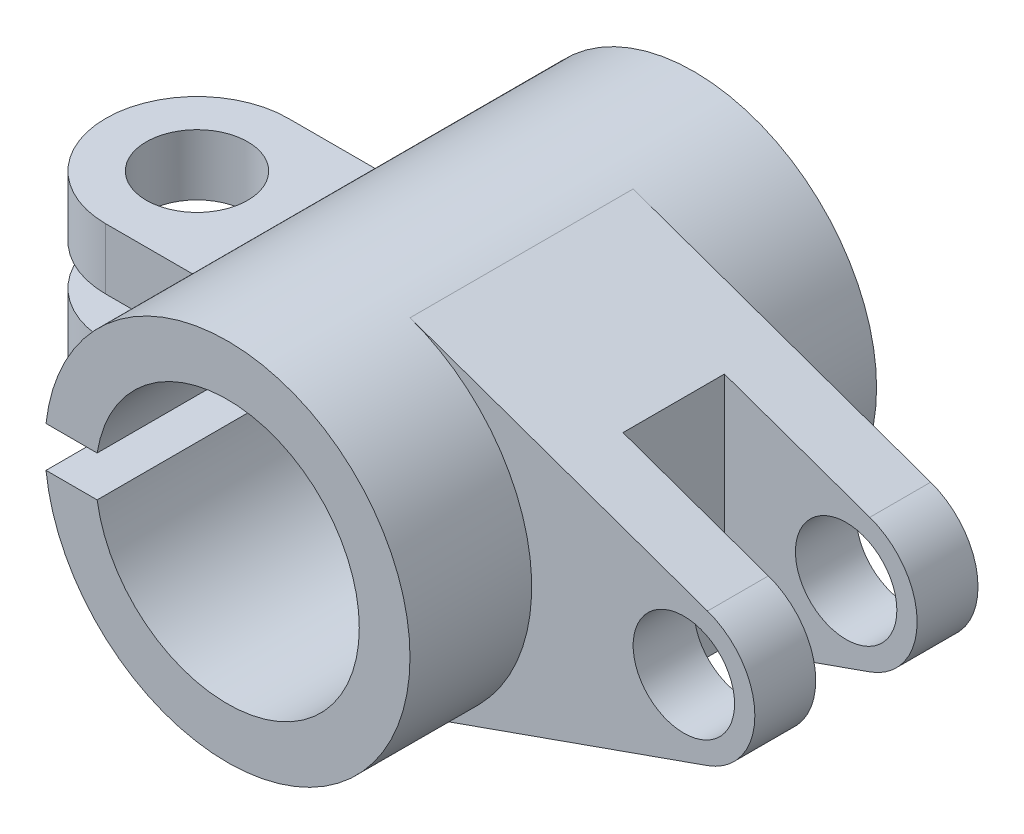
ISO-10303-21;
HEADER;
FILE_DESCRIPTION(('STEP AP214'),'2;1');
FILE_NAME('part.step','',(''),(''),'','','');
FILE_SCHEMA(('AUTOMOTIVE_DESIGN { 1 0 10303 214 1 1 1 1 }'));
ENDSEC;
DATA;
#1=APPLICATION_CONTEXT('core data for automotive mechanical design processes');
#2=APPLICATION_PROTOCOL_DEFINITION('international standard','automotive_design',2000,#1);
#3=PRODUCT_CONTEXT('',#1,'mechanical');
#4=PRODUCT('Part','Part','',(#3));
#5=PRODUCT_RELATED_PRODUCT_CATEGORY('part','',(#4));
#6=PRODUCT_DEFINITION_FORMATION('','',#4);
#7=PRODUCT_DEFINITION_CONTEXT('part definition',#1,'design');
#8=PRODUCT_DEFINITION('design','',#6,#7);
#9=PRODUCT_DEFINITION_SHAPE('','',#8);
#10=(LENGTH_UNIT() NAMED_UNIT(*) SI_UNIT(.MILLI.,.METRE.));
#11=(NAMED_UNIT(*) PLANE_ANGLE_UNIT() SI_UNIT($,.RADIAN.));
#12=(NAMED_UNIT(*) SI_UNIT($,.STERADIAN.) SOLID_ANGLE_UNIT());
#13=UNCERTAINTY_MEASURE_WITH_UNIT(LENGTH_MEASURE(1.E-05),#10,'distance_accuracy_value','');
#14=(GEOMETRIC_REPRESENTATION_CONTEXT(3) GLOBAL_UNCERTAINTY_ASSIGNED_CONTEXT((#13)) GLOBAL_UNIT_ASSIGNED_CONTEXT((#10,
#11,#12)) REPRESENTATION_CONTEXT('',''));
#15=CARTESIAN_POINT('',(0.,0.,0.));
#16=DIRECTION('',(0.,0.,1.));
#17=DIRECTION('',(1.,0.,0.));
#18=AXIS2_PLACEMENT_3D('',#15,#16,#17);
#19=CARTESIAN_POINT('',(21.,0.,34.));
#20=DIRECTION('',(1.,0.,0.));
#21=DIRECTION('',(0.,0.,-1.));
#22=AXIS2_PLACEMENT_3D('',#19,#20,#21);
#23=PLANE('',#22);
#24=DIRECTION('',(0.,0.,-1.));
#25=VECTOR('',#24,1.);
#26=CARTESIAN_POINT('',(21.,11.667261889578,34.));
#27=LINE('',#26,#25);
#28=CARTESIAN_POINT('',(21.,11.667261889578,28.));
#29=VERTEX_POINT('',#28);
#30=CARTESIAN_POINT('',(21.,11.667261889578,18.));
#31=VERTEX_POINT('',#30);
#32=EDGE_CURVE('E68',#29,#31,#27,.T.);
#33=ORIENTED_EDGE('',*,*,#32,.F.);
#34=DIRECTION('',(0.,-1.,0.));
#35=VECTOR('',#34,1.);
#36=CARTESIAN_POINT('',(21.,0.,28.));
#37=LINE('',#36,#35);
#38=CARTESIAN_POINT('',(21.,-11.667261889578,28.));
#39=VERTEX_POINT('',#38);
#40=EDGE_CURVE('E63',#29,#39,#37,.T.);
#41=ORIENTED_EDGE('',*,*,#40,.T.);
#42=DIRECTION('',(0.,0.,-1.));
#43=VECTOR('',#42,1.);
#44=CARTESIAN_POINT('',(21.,-11.667261889578,34.));
#45=LINE('',#44,#43);
#46=CARTESIAN_POINT('',(21.,-11.667261889578,18.));
#47=VERTEX_POINT('',#46);
#48=EDGE_CURVE('E373',#39,#47,#45,.T.);
#49=ORIENTED_EDGE('',*,*,#48,.T.);
#50=DIRECTION('',(0.,-1.,0.));
#51=VECTOR('',#50,1.);
#52=CARTESIAN_POINT('',(21.,0.,18.));
#53=LINE('',#52,#51);
#54=EDGE_CURVE('E398',#31,#47,#53,.T.);
#55=ORIENTED_EDGE('',*,*,#54,.F.);
#56=EDGE_LOOP('',(#33,#41,#49,#55));
#57=FACE_BOUND('',#56,.T.);
#58=ADVANCED_FACE('F47',(#57),#23,.T.);
#59=CARTESIAN_POINT('',(6.,-16.9705627484771,18.));
#60=DIRECTION('',(0.333333333333333,-0.942809041582063,0.));
#61=DIRECTION('',(0.942809041582063,0.333333333333333,0.));
#62=AXIS2_PLACEMENT_3D('',#59,#60,#61);
#63=PLANE('',#62);
#64=DIRECTION('',(-0.942809041582063,-0.333333333333333,0.));
#65=VECTOR('',#64,1.);
#66=CARTESIAN_POINT('',(6.,-16.9705627484771,12.));
#67=LINE('',#66,#65);
#68=CARTESIAN_POINT('',(35.3333333333333,-6.59966329107444,12.));
#69=VERTEX_POINT('',#68);
#70=CARTESIAN_POINT('',(6.,-16.9705627484771,12.));
#71=VERTEX_POINT('',#70);
#72=EDGE_CURVE('E405',#69,#71,#67,.T.);
#73=ORIENTED_EDGE('',*,*,#72,.F.);
#74=DIRECTION('',(0.,0.,-1.));
#75=VECTOR('',#74,1.);
#76=CARTESIAN_POINT('',(35.3333333333333,-6.59966329107444,18.));
#77=LINE('',#76,#75);
#78=CARTESIAN_POINT('',(35.3333333333333,-6.59966329107444,18.));
#79=VERTEX_POINT('',#78);
#80=EDGE_CURVE('E11',#79,#69,#77,.T.);
#81=ORIENTED_EDGE('',*,*,#80,.F.);
#82=DIRECTION('',(-0.942809041582063,-0.333333333333333,0.));
#83=VECTOR('',#82,1.);
#84=CARTESIAN_POINT('',(6.,-16.9705627484771,18.));
#85=LINE('',#84,#83);
#86=EDGE_CURVE('E385',#79,#47,#85,.T.);
#87=ORIENTED_EDGE('',*,*,#86,.T.);
#88=ORIENTED_EDGE('',*,*,#48,.F.);
#89=DIRECTION('',(-0.942809041582063,-0.333333333333333,0.));
#90=VECTOR('',#89,1.);
#91=CARTESIAN_POINT('',(6.,-16.9705627484771,28.));
#92=LINE('',#91,#90);
#93=CARTESIAN_POINT('',(35.3333333333333,-6.59966329107444,28.));
#94=VERTEX_POINT('',#93);
#95=EDGE_CURVE('E331',#94,#39,#92,.T.);
#96=ORIENTED_EDGE('',*,*,#95,.F.);
#97=DIRECTION('',(0.,0.,-1.));
#98=VECTOR('',#97,1.);
#99=CARTESIAN_POINT('',(35.3333333333333,-6.59966329107444,34.));
#100=LINE('',#99,#98);
#101=CARTESIAN_POINT('',(35.3333333333333,-6.59966329107444,34.));
#102=VERTEX_POINT('',#101);
#103=EDGE_CURVE('E348',#102,#94,#100,.T.);
#104=ORIENTED_EDGE('',*,*,#103,.F.);
#105=DIRECTION('',(-0.942809041582063,-0.333333333333333,0.));
#106=VECTOR('',#105,1.);
#107=CARTESIAN_POINT('',(6.,-16.9705627484771,34.));
#108=LINE('',#107,#106);
#109=CARTESIAN_POINT('',(6.,-16.9705627484771,34.));
#110=VERTEX_POINT('',#109);
#111=EDGE_CURVE('E356',#102,#110,#108,.T.);
#112=ORIENTED_EDGE('',*,*,#111,.T.);
#113=DIRECTION('',(0.,0.,-1.));
#114=VECTOR('',#113,1.);
#115=CARTESIAN_POINT('',(6.,-16.9705627484771,34.));
#116=LINE('',#115,#114);
#117=EDGE_CURVE('E376',#110,#71,#116,.T.);
#118=ORIENTED_EDGE('',*,*,#117,.T.);
#119=EDGE_LOOP('',(#73,#81,#87,#88,#96,#104,#112,#118));
#120=FACE_BOUND('',#119,.T.);
#121=ADVANCED_FACE('F426',(#120),#63,.T.);
#122=CARTESIAN_POINT('',(33.,0.,18.));
#123=DIRECTION('',(0.,0.,-1.));
#124=DIRECTION('',(-1.,0.,0.));
#125=AXIS2_PLACEMENT_3D('',#122,#123,#124);
#126=CYLINDRICAL_SURFACE('',#125,7.);
#127=CARTESIAN_POINT('',(33.,0.,12.));
#128=DIRECTION('',(0.,0.,1.));
#129=DIRECTION('',(1.,0.,0.));
#130=AXIS2_PLACEMENT_3D('',#127,#128,#129);
#131=CIRCLE('',#130,7.);
#132=CARTESIAN_POINT('',(35.3333333333333,6.59966329107444,12.));
#133=VERTEX_POINT('',#132);
#134=EDGE_CURVE('E408',#69,#133,#131,.T.);
#135=ORIENTED_EDGE('',*,*,#134,.T.);
#136=DIRECTION('',(0.,0.,-1.));
#137=VECTOR('',#136,1.);
#138=CARTESIAN_POINT('',(35.3333333333333,6.59966329107444,18.));
#139=LINE('',#138,#137);
#140=CARTESIAN_POINT('',(35.3333333333333,6.59966329107444,18.));
#141=VERTEX_POINT('',#140);
#142=EDGE_CURVE('E56',#141,#133,#139,.T.);
#143=ORIENTED_EDGE('',*,*,#142,.F.);
#144=CARTESIAN_POINT('',(33.,0.,18.));
#145=DIRECTION('',(0.,0.,1.));
#146=DIRECTION('',(1.,0.,0.));
#147=AXIS2_PLACEMENT_3D('',#144,#145,#146);
#148=CIRCLE('',#147,7.);
#149=EDGE_CURVE('E390',#79,#141,#148,.T.);
#150=ORIENTED_EDGE('',*,*,#149,.F.);
#151=ORIENTED_EDGE('',*,*,#80,.T.);
#152=EDGE_LOOP('',(#135,#143,#150,#151));
#153=FACE_BOUND('',#152,.T.);
#154=ADVANCED_FACE('F421',(#153),#126,.T.);
#155=CARTESIAN_POINT('',(6.,16.9705627484771,18.));
#156=DIRECTION('',(-0.333333333333333,-0.942809041582063,0.));
#157=DIRECTION('',(0.942809041582063,-0.333333333333333,0.));
#158=AXIS2_PLACEMENT_3D('',#155,#156,#157);
#159=PLANE('',#158);
#160=DIRECTION('',(-0.942809041582063,0.333333333333333,0.));
#161=VECTOR('',#160,1.);
#162=CARTESIAN_POINT('',(6.,16.9705627484771,12.));
#163=LINE('',#162,#161);
#164=CARTESIAN_POINT('',(6.,16.9705627484771,12.));
#165=VERTEX_POINT('',#164);
#166=EDGE_CURVE('E386',#133,#165,#163,.T.);
#167=ORIENTED_EDGE('',*,*,#166,.T.);
#168=DIRECTION('',(0.,0.,-1.));
#169=VECTOR('',#168,1.);
#170=CARTESIAN_POINT('',(6.,16.9705627484771,34.));
#171=LINE('',#170,#169);
#172=CARTESIAN_POINT('',(6.,16.9705627484771,34.));
#173=VERTEX_POINT('',#172);
#174=EDGE_CURVE('E364',#173,#165,#171,.T.);
#175=ORIENTED_EDGE('',*,*,#174,.F.);
#176=DIRECTION('',(-0.942809041582063,0.333333333333333,0.));
#177=VECTOR('',#176,1.);
#178=CARTESIAN_POINT('',(6.,16.9705627484771,34.));
#179=LINE('',#178,#177);
#180=CARTESIAN_POINT('',(35.3333333333333,6.59966329107444,34.));
#181=VERTEX_POINT('',#180);
#182=EDGE_CURVE('E360',#181,#173,#179,.T.);
#183=ORIENTED_EDGE('',*,*,#182,.F.);
#184=DIRECTION('',(0.,0.,-1.));
#185=VECTOR('',#184,1.);
#186=CARTESIAN_POINT('',(35.3333333333333,6.59966329107444,34.));
#187=LINE('',#186,#185);
#188=CARTESIAN_POINT('',(35.3333333333333,6.59966329107444,28.));
#189=VERTEX_POINT('',#188);
#190=EDGE_CURVE('E327',#181,#189,#187,.T.);
#191=ORIENTED_EDGE('',*,*,#190,.T.);
#192=DIRECTION('',(-0.942809041582063,0.333333333333333,0.));
#193=VECTOR('',#192,1.);
#194=CARTESIAN_POINT('',(6.,16.9705627484771,28.));
#195=LINE('',#194,#193);
#196=EDGE_CURVE('E339',#189,#29,#195,.T.);
#197=ORIENTED_EDGE('',*,*,#196,.T.);
#198=ORIENTED_EDGE('',*,*,#32,.T.);
#199=DIRECTION('',(-0.942809041582063,0.333333333333333,0.));
#200=VECTOR('',#199,1.);
#201=CARTESIAN_POINT('',(6.,16.9705627484771,18.));
#202=LINE('',#201,#200);
#203=EDGE_CURVE('E394',#141,#31,#202,.T.);
#204=ORIENTED_EDGE('',*,*,#203,.F.);
#205=ORIENTED_EDGE('',*,*,#142,.T.);
#206=EDGE_LOOP('',(#167,#175,#183,#191,#197,#198,#204,#205));
#207=FACE_BOUND('',#206,.T.);
#208=ADVANCED_FACE('F417',(#207),#159,.F.);
#209=CARTESIAN_POINT('',(33.,0.,18.));
#210=DIRECTION('',(0.,0.,-1.));
#211=DIRECTION('',(-1.,0.,0.));
#212=AXIS2_PLACEMENT_3D('',#209,#210,#211);
#213=CYLINDRICAL_SURFACE('',#212,5.);
#214=CARTESIAN_POINT('',(33.,0.,18.));
#215=DIRECTION('',(0.,0.,1.));
#216=DIRECTION('',(1.,0.,0.));
#217=AXIS2_PLACEMENT_3D('',#214,#215,#216);
#218=CIRCLE('',#217,5.);
#219=CARTESIAN_POINT('',(38.,0.,18.));
#220=VERTEX_POINT('',#219);
#221=EDGE_CURVE('E381',#220,#220,#218,.T.);
#222=ORIENTED_EDGE('',*,*,#221,.T.);
#223=EDGE_LOOP('',(#222));
#224=FACE_BOUND('',#223,.T.);
#225=CARTESIAN_POINT('',(33.,0.,12.));
#226=DIRECTION('',(0.,0.,1.));
#227=DIRECTION('',(1.,0.,0.));
#228=AXIS2_PLACEMENT_3D('',#225,#226,#227);
#229=CIRCLE('',#228,5.);
#230=CARTESIAN_POINT('',(38.,0.,12.));
#231=VERTEX_POINT('',#230);
#232=EDGE_CURVE('E380',#231,#231,#229,.T.);
#233=ORIENTED_EDGE('',*,*,#232,.F.);
#234=EDGE_LOOP('',(#233));
#235=FACE_BOUND('',#234,.T.);
#236=ADVANCED_FACE('F49',(#224,#235),#213,.F.);
#237=CARTESIAN_POINT('',(0.,0.,18.));
#238=DIRECTION('',(0.,0.,1.));
#239=DIRECTION('',(1.,0.,0.));
#240=AXIS2_PLACEMENT_3D('',#237,#238,#239);
#241=PLANE('',#240);
#242=ORIENTED_EDGE('',*,*,#221,.F.);
#243=EDGE_LOOP('',(#242));
#244=FACE_BOUND('',#243,.T.);
#245=ORIENTED_EDGE('',*,*,#86,.F.);
#246=ORIENTED_EDGE('',*,*,#149,.T.);
#247=ORIENTED_EDGE('',*,*,#203,.T.);
#248=ORIENTED_EDGE('',*,*,#54,.T.);
#249=EDGE_LOOP('',(#245,#246,#247,#248));
#250=FACE_BOUND('',#249,.T.);
#251=ADVANCED_FACE('F443',(#244,#250),#241,.T.);
#252=CARTESIAN_POINT('',(0.,0.,12.));
#253=DIRECTION('',(0.,0.,1.));
#254=DIRECTION('',(1.,0.,0.));
#255=AXIS2_PLACEMENT_3D('',#252,#253,#254);
#256=PLANE('',#255);
#257=ORIENTED_EDGE('',*,*,#232,.T.);
#258=EDGE_LOOP('',(#257));
#259=FACE_BOUND('',#258,.T.);
#260=ORIENTED_EDGE('',*,*,#72,.T.);
#261=CARTESIAN_POINT('',(0.,0.,12.));
#262=DIRECTION('',(0.,0.,1.));
#263=DIRECTION('',(1.,0.,0.));
#264=AXIS2_PLACEMENT_3D('',#261,#262,#263);
#265=CIRCLE('',#264,18.);
#266=EDGE_CURVE('E351',#71,#165,#265,.T.);
#267=ORIENTED_EDGE('',*,*,#266,.T.);
#268=ORIENTED_EDGE('',*,*,#166,.F.);
#269=ORIENTED_EDGE('',*,*,#134,.F.);
#270=EDGE_LOOP('',(#260,#267,#268,#269));
#271=FACE_BOUND('',#270,.T.);
#272=ADVANCED_FACE('F424',(#259,#271),#256,.F.);
#273=CARTESIAN_POINT('',(0.,0.,34.));
#274=DIRECTION('',(0.,0.,1.));
#275=DIRECTION('',(1.,0.,0.));
#276=AXIS2_PLACEMENT_3D('',#273,#274,#275);
#277=PLANE('',#276);
#278=CARTESIAN_POINT('',(0.,0.,34.));
#279=DIRECTION('',(0.,0.,1.));
#280=DIRECTION('',(1.,0.,0.));
#281=AXIS2_PLACEMENT_3D('',#278,#279,#280);
#282=CIRCLE('',#281,18.);
#283=EDGE_CURVE('E352',#110,#173,#282,.T.);
#284=ORIENTED_EDGE('',*,*,#283,.F.);
#285=ORIENTED_EDGE('',*,*,#111,.F.);
#286=CARTESIAN_POINT('',(33.,0.,34.));
#287=DIRECTION('',(0.,0.,1.));
#288=DIRECTION('',(1.,0.,0.));
#289=AXIS2_PLACEMENT_3D('',#286,#287,#288);
#290=CIRCLE('',#289,7.);
#291=EDGE_CURVE('E323',#102,#181,#290,.T.);
#292=ORIENTED_EDGE('',*,*,#291,.T.);
#293=ORIENTED_EDGE('',*,*,#182,.T.);
#294=EDGE_LOOP('',(#284,#285,#292,#293));
#295=FACE_BOUND('',#294,.T.);
#296=CARTESIAN_POINT('',(33.,0.,34.));
#297=DIRECTION('',(0.,0.,1.));
#298=DIRECTION('',(1.,0.,0.));
#299=AXIS2_PLACEMENT_3D('',#296,#297,#298);
#300=CIRCLE('',#299,5.);
#301=CARTESIAN_POINT('',(38.,0.,34.));
#302=VERTEX_POINT('',#301);
#303=EDGE_CURVE('E319',#302,#302,#300,.T.);
#304=ORIENTED_EDGE('',*,*,#303,.F.);
#305=EDGE_LOOP('',(#304));
#306=FACE_BOUND('',#305,.T.);
#307=ADVANCED_FACE('F431',(#295,#306),#277,.T.);
#308=CARTESIAN_POINT('',(33.,0.,34.));
#309=DIRECTION('',(0.,0.,-1.));
#310=DIRECTION('',(-1.,0.,0.));
#311=AXIS2_PLACEMENT_3D('',#308,#309,#310);
#312=CYLINDRICAL_SURFACE('',#311,7.);
#313=CARTESIAN_POINT('',(33.,0.,28.));
#314=DIRECTION('',(0.,0.,1.));
#315=DIRECTION('',(1.,0.,0.));
#316=AXIS2_PLACEMENT_3D('',#313,#314,#315);
#317=CIRCLE('',#316,7.);
#318=EDGE_CURVE('E335',#94,#189,#317,.T.);
#319=ORIENTED_EDGE('',*,*,#318,.T.);
#320=ORIENTED_EDGE('',*,*,#190,.F.);
#321=ORIENTED_EDGE('',*,*,#291,.F.);
#322=ORIENTED_EDGE('',*,*,#103,.T.);
#323=EDGE_LOOP('',(#319,#320,#321,#322));
#324=FACE_BOUND('',#323,.T.);
#325=ADVANCED_FACE('F436',(#324),#312,.T.);
#326=CARTESIAN_POINT('',(33.,0.,34.));
#327=DIRECTION('',(0.,0.,-1.));
#328=DIRECTION('',(-1.,0.,0.));
#329=AXIS2_PLACEMENT_3D('',#326,#327,#328);
#330=CYLINDRICAL_SURFACE('',#329,5.);
#331=ORIENTED_EDGE('',*,*,#303,.T.);
#332=EDGE_LOOP('',(#331));
#333=FACE_BOUND('',#332,.T.);
#334=CARTESIAN_POINT('',(33.,0.,28.));
#335=DIRECTION('',(0.,0.,1.));
#336=DIRECTION('',(1.,0.,0.));
#337=AXIS2_PLACEMENT_3D('',#334,#335,#336);
#338=CIRCLE('',#337,5.);
#339=CARTESIAN_POINT('',(38.,0.,28.));
#340=VERTEX_POINT('',#339);
#341=EDGE_CURVE('E318',#340,#340,#338,.T.);
#342=ORIENTED_EDGE('',*,*,#341,.F.);
#343=EDGE_LOOP('',(#342));
#344=FACE_BOUND('',#343,.T.);
#345=ADVANCED_FACE('F463',(#333,#344),#330,.F.);
#346=CARTESIAN_POINT('',(0.,0.,28.));
#347=DIRECTION('',(0.,0.,1.));
#348=DIRECTION('',(1.,0.,0.));
#349=AXIS2_PLACEMENT_3D('',#346,#347,#348);
#350=PLANE('',#349);
#351=ORIENTED_EDGE('',*,*,#341,.T.);
#352=EDGE_LOOP('',(#351));
#353=FACE_BOUND('',#352,.T.);
#354=ORIENTED_EDGE('',*,*,#95,.T.);
#355=ORIENTED_EDGE('',*,*,#40,.F.);
#356=ORIENTED_EDGE('',*,*,#196,.F.);
#357=ORIENTED_EDGE('',*,*,#318,.F.);
#358=EDGE_LOOP('',(#354,#355,#356,#357));
#359=FACE_BOUND('',#358,.T.);
#360=ADVANCED_FACE('F439',(#353,#359),#350,.F.);
#361=CARTESIAN_POINT('',(0.,0.,46.));
#362=DIRECTION('',(0.,0.,-1.));
#363=DIRECTION('',(-1.,0.,0.));
#364=AXIS2_PLACEMENT_3D('',#361,#362,#363);
#365=CYLINDRICAL_SURFACE('',#364,18.);
#366=DIRECTION('',(0.,0.,-1.));
#367=VECTOR('',#366,1.);
#368=CARTESIAN_POINT('',(-17.8885438199983,-2.,46.));
#369=LINE('',#368,#367);
#370=CARTESIAN_POINT('',(-17.8885438199983,-2.,46.));
#371=VERTEX_POINT('',#370);
#372=CARTESIAN_POINT('',(-17.8885438199983,-2.,32.));
#373=VERTEX_POINT('',#372);
#374=EDGE_CURVE('E286',#371,#373,#369,.T.);
#375=ORIENTED_EDGE('',*,*,#374,.T.);
#376=CARTESIAN_POINT('',(0.,0.,32.));
#377=DIRECTION('',(0.,0.,1.));
#378=DIRECTION('',(1.,0.,0.));
#379=AXIS2_PLACEMENT_3D('',#376,#377,#378);
#380=CIRCLE('',#379,18.);
#381=CARTESIAN_POINT('',(-16.1245154965971,-8.,32.));
#382=VERTEX_POINT('',#381);
#383=EDGE_CURVE('E193',#373,#382,#380,.T.);
#384=ORIENTED_EDGE('',*,*,#383,.T.);
#385=DIRECTION('',(0.,0.,-1.));
#386=VECTOR('',#385,1.);
#387=CARTESIAN_POINT('',(-16.1245154965971,-8.,32.));
#388=LINE('',#387,#386);
#389=CARTESIAN_POINT('',(-16.1245154965971,-8.,14.));
#390=VERTEX_POINT('',#389);
#391=EDGE_CURVE('E186',#382,#390,#388,.T.);
#392=ORIENTED_EDGE('',*,*,#391,.T.);
#393=CARTESIAN_POINT('',(0.,0.,14.));
#394=DIRECTION('',(0.,0.,1.));
#395=DIRECTION('',(1.,0.,0.));
#396=AXIS2_PLACEMENT_3D('',#393,#394,#395);
#397=CIRCLE('',#396,18.);
#398=CARTESIAN_POINT('',(-17.8885438199983,-2.,14.));
#399=VERTEX_POINT('',#398);
#400=EDGE_CURVE('E200',#399,#390,#397,.T.);
#401=ORIENTED_EDGE('',*,*,#400,.F.);
#402=CARTESIAN_POINT('',(-17.8885438199983,-2.,0.));
#403=VERTEX_POINT('',#402);
#404=EDGE_CURVE('E285',#399,#403,#369,.T.);
#405=ORIENTED_EDGE('',*,*,#404,.T.);
#406=CARTESIAN_POINT('',(0.,0.,0.));
#407=DIRECTION('',(0.,0.,1.));
#408=DIRECTION('',(1.,0.,0.));
#409=AXIS2_PLACEMENT_3D('',#406,#407,#408);
#410=CIRCLE('',#409,18.);
#411=CARTESIAN_POINT('',(-17.8885438199983,2.,0.));
#412=VERTEX_POINT('',#411);
#413=EDGE_CURVE('E271',#403,#412,#410,.T.);
#414=ORIENTED_EDGE('',*,*,#413,.T.);
#415=DIRECTION('',(0.,0.,-1.));
#416=VECTOR('',#415,1.);
#417=CARTESIAN_POINT('',(-17.8885438199983,2.,46.));
#418=LINE('',#417,#416);
#419=CARTESIAN_POINT('',(-17.8885438199983,2.,14.));
#420=VERTEX_POINT('',#419);
#421=EDGE_CURVE('E280',#420,#412,#418,.T.);
#422=ORIENTED_EDGE('',*,*,#421,.F.);
#423=CARTESIAN_POINT('',(0.,0.,14.));
#424=DIRECTION('',(0.,0.,1.));
#425=DIRECTION('',(1.,0.,0.));
#426=AXIS2_PLACEMENT_3D('',#423,#424,#425);
#427=CIRCLE('',#426,18.);
#428=CARTESIAN_POINT('',(-16.1245154965971,7.99999999999999,14.));
#429=VERTEX_POINT('',#428);
#430=EDGE_CURVE('E204',#429,#420,#427,.T.);
#431=ORIENTED_EDGE('',*,*,#430,.F.);
#432=DIRECTION('',(0.,0.,-1.));
#433=VECTOR('',#432,1.);
#434=CARTESIAN_POINT('',(-16.1245154965971,7.99999999999999,32.));
#435=LINE('',#434,#433);
#436=CARTESIAN_POINT('',(-16.1245154965971,7.99999999999999,32.));
#437=VERTEX_POINT('',#436);
#438=EDGE_CURVE('E234',#437,#429,#435,.T.);
#439=ORIENTED_EDGE('',*,*,#438,.F.);
#440=CARTESIAN_POINT('',(0.,0.,32.));
#441=DIRECTION('',(0.,0.,1.));
#442=DIRECTION('',(1.,0.,0.));
#443=AXIS2_PLACEMENT_3D('',#440,#441,#442);
#444=CIRCLE('',#443,18.);
#445=CARTESIAN_POINT('',(-17.8885438199983,2.,32.));
#446=VERTEX_POINT('',#445);
#447=EDGE_CURVE('E222',#437,#446,#444,.T.);
#448=ORIENTED_EDGE('',*,*,#447,.T.);
#449=CARTESIAN_POINT('',(-17.8885438199983,2.,46.));
#450=VERTEX_POINT('',#449);
#451=EDGE_CURVE('E281',#450,#446,#418,.T.);
#452=ORIENTED_EDGE('',*,*,#451,.F.);
#453=CARTESIAN_POINT('',(0.,0.,46.));
#454=DIRECTION('',(0.,0.,1.));
#455=DIRECTION('',(1.,0.,0.));
#456=AXIS2_PLACEMENT_3D('',#453,#454,#455);
#457=CIRCLE('',#456,18.);
#458=EDGE_CURVE('E256',#371,#450,#457,.T.);
#459=ORIENTED_EDGE('',*,*,#458,.F.);
#460=EDGE_LOOP('',(#375,#384,#392,#401,#405,#414,#422,#431,#439,#448,#452,#459));
#461=FACE_BOUND('',#460,.T.);
#462=ORIENTED_EDGE('',*,*,#174,.T.);
#463=ORIENTED_EDGE('',*,*,#266,.F.);
#464=ORIENTED_EDGE('',*,*,#117,.F.);
#465=ORIENTED_EDGE('',*,*,#283,.T.);
#466=EDGE_LOOP('',(#462,#463,#464,#465));
#467=FACE_BOUND('',#466,.T.);
#468=ADVANCED_FACE('F198',(#461,#467),#365,.T.);
#469=CARTESIAN_POINT('',(-26.,-2.,23.));
#470=DIRECTION('',(0.,-1.,0.));
#471=DIRECTION('',(0.,0.,-1.));
#472=AXIS2_PLACEMENT_3D('',#469,#470,#471);
#473=CYLINDRICAL_SURFACE('',#472,9.);
#474=DIRECTION('',(0.,1.,0.));
#475=VECTOR('',#474,1.);
#476=CARTESIAN_POINT('',(-26.,-2.,32.));
#477=LINE('',#476,#475);
#478=CARTESIAN_POINT('',(-26.,-2.,32.));
#479=VERTEX_POINT('',#478);
#480=CARTESIAN_POINT('',(-26.,-8.,32.));
#481=VERTEX_POINT('',#480);
#482=EDGE_CURVE('E306',#479,#481,#477,.F.);
#483=ORIENTED_EDGE('',*,*,#482,.F.);
#484=CARTESIAN_POINT('',(-26.,-2.,23.));
#485=DIRECTION('',(0.,-1.,0.));
#486=DIRECTION('',(1.,0.,0.));
#487=AXIS2_PLACEMENT_3D('',#484,#485,#486);
#488=CIRCLE('',#487,9.);
#489=CARTESIAN_POINT('',(-26.,-2.,14.));
#490=VERTEX_POINT('',#489);
#491=EDGE_CURVE('E313',#490,#479,#488,.F.);
#492=ORIENTED_EDGE('',*,*,#491,.F.);
#493=DIRECTION('',(0.,-1.,0.));
#494=VECTOR('',#493,1.);
#495=CARTESIAN_POINT('',(-26.,0.,14.));
#496=LINE('',#495,#494);
#497=CARTESIAN_POINT('',(-26.,-8.,14.));
#498=VERTEX_POINT('',#497);
#499=EDGE_CURVE('E310',#498,#490,#496,.F.);
#500=ORIENTED_EDGE('',*,*,#499,.F.);
#501=CARTESIAN_POINT('',(-26.,-8.,23.));
#502=DIRECTION('',(0.,1.,0.));
#503=DIRECTION('',(-1.,0.,0.));
#504=AXIS2_PLACEMENT_3D('',#501,#502,#503);
#505=CIRCLE('',#504,9.);
#506=EDGE_CURVE('E187',#481,#498,#505,.F.);
#507=ORIENTED_EDGE('',*,*,#506,.F.);
#508=EDGE_LOOP('',(#483,#492,#500,#507));
#509=FACE_BOUND('',#508,.T.);
#510=ADVANCED_FACE('F473',(#509),#473,.T.);
#511=CARTESIAN_POINT('',(-26.,7.99999999999999,23.));
#512=DIRECTION('',(0.,1.,0.));
#513=DIRECTION('',(0.,0.,1.));
#514=AXIS2_PLACEMENT_3D('',#511,#512,#513);
#515=CYLINDRICAL_SURFACE('',#514,9.);
#516=DIRECTION('',(0.,1.,0.));
#517=VECTOR('',#516,1.);
#518=CARTESIAN_POINT('',(-26.,0.,32.));
#519=LINE('',#518,#517);
#520=CARTESIAN_POINT('',(-26.,7.99999999999999,32.));
#521=VERTEX_POINT('',#520);
#522=CARTESIAN_POINT('',(-26.,2.,32.));
#523=VERTEX_POINT('',#522);
#524=EDGE_CURVE('E292',#521,#523,#519,.F.);
#525=ORIENTED_EDGE('',*,*,#524,.F.);
#526=CARTESIAN_POINT('',(-26.,7.99999999999999,23.));
#527=DIRECTION('',(0.,1.,0.));
#528=DIRECTION('',(0.,0.,1.));
#529=AXIS2_PLACEMENT_3D('',#526,#527,#528);
#530=CIRCLE('',#529,9.);
#531=CARTESIAN_POINT('',(-26.,7.99999999999999,14.));
#532=VERTEX_POINT('',#531);
#533=EDGE_CURVE('E300',#532,#521,#530,.T.);
#534=ORIENTED_EDGE('',*,*,#533,.F.);
#535=DIRECTION('',(0.,-1.,0.));
#536=VECTOR('',#535,1.);
#537=CARTESIAN_POINT('',(-26.,7.99999999999999,14.));
#538=LINE('',#537,#536);
#539=CARTESIAN_POINT('',(-26.,2.,14.));
#540=VERTEX_POINT('',#539);
#541=EDGE_CURVE('E296',#540,#532,#538,.F.);
#542=ORIENTED_EDGE('',*,*,#541,.F.);
#543=CARTESIAN_POINT('',(-26.,2.,23.));
#544=DIRECTION('',(0.,-1.,0.));
#545=DIRECTION('',(1.,0.,0.));
#546=AXIS2_PLACEMENT_3D('',#543,#544,#545);
#547=CIRCLE('',#546,9.);
#548=EDGE_CURVE('E303',#523,#540,#547,.T.);
#549=ORIENTED_EDGE('',*,*,#548,.F.);
#550=EDGE_LOOP('',(#525,#534,#542,#549));
#551=FACE_BOUND('',#550,.T.);
#552=ADVANCED_FACE('F479',(#551),#515,.T.);
#553=CARTESIAN_POINT('',(0.,0.,46.));
#554=DIRECTION('',(0.,0.,-1.));
#555=DIRECTION('',(-1.,0.,0.));
#556=AXIS2_PLACEMENT_3D('',#553,#554,#555);
#557=CYLINDRICAL_SURFACE('',#556,13.);
#558=CARTESIAN_POINT('',(0.,0.,0.));
#559=DIRECTION('',(0.,0.,1.));
#560=DIRECTION('',(1.,0.,0.));
#561=AXIS2_PLACEMENT_3D('',#558,#559,#560);
#562=CIRCLE('',#561,13.);
#563=CARTESIAN_POINT('',(-12.8452325786651,-2.,0.));
#564=VERTEX_POINT('',#563);
#565=CARTESIAN_POINT('',(-12.8452325786651,2.,0.));
#566=VERTEX_POINT('',#565);
#567=EDGE_CURVE('E247',#564,#566,#562,.T.);
#568=ORIENTED_EDGE('',*,*,#567,.F.);
#569=DIRECTION('',(0.,0.,-1.));
#570=VECTOR('',#569,1.);
#571=CARTESIAN_POINT('',(-12.8452325786651,-2.,46.));
#572=LINE('',#571,#570);
#573=CARTESIAN_POINT('',(-12.8452325786651,-2.,46.));
#574=VERTEX_POINT('',#573);
#575=EDGE_CURVE('E289',#574,#564,#572,.T.);
#576=ORIENTED_EDGE('',*,*,#575,.F.);
#577=CARTESIAN_POINT('',(0.,0.,46.));
#578=DIRECTION('',(0.,0.,1.));
#579=DIRECTION('',(1.,0.,0.));
#580=AXIS2_PLACEMENT_3D('',#577,#578,#579);
#581=CIRCLE('',#580,13.);
#582=CARTESIAN_POINT('',(-12.8452325786651,2.,46.));
#583=VERTEX_POINT('',#582);
#584=EDGE_CURVE('E248',#574,#583,#581,.T.);
#585=ORIENTED_EDGE('',*,*,#584,.T.);
#586=DIRECTION('',(0.,0.,-1.));
#587=VECTOR('',#586,1.);
#588=CARTESIAN_POINT('',(-12.8452325786651,2.,46.));
#589=LINE('',#588,#587);
#590=EDGE_CURVE('E263',#583,#566,#589,.T.);
#591=ORIENTED_EDGE('',*,*,#590,.T.);
#592=EDGE_LOOP('',(#568,#576,#585,#591));
#593=FACE_BOUND('',#592,.T.);
#594=ADVANCED_FACE('F485',(#593),#557,.F.);
#595=CARTESIAN_POINT('',(0.,-2.,46.));
#596=DIRECTION('',(0.,-1.,0.));
#597=DIRECTION('',(1.,0.,0.));
#598=AXIS2_PLACEMENT_3D('',#595,#596,#597);
#599=PLANE('',#598);
#600=CARTESIAN_POINT('',(-26.,-2.,23.));
#601=DIRECTION('',(0.,-1.,0.));
#602=DIRECTION('',(1.,0.,0.));
#603=AXIS2_PLACEMENT_3D('',#600,#601,#602);
#604=CIRCLE('',#603,5.);
#605=CARTESIAN_POINT('',(-21.,-2.,23.));
#606=VERTEX_POINT('',#605);
#607=EDGE_CURVE('E211',#606,#606,#604,.T.);
#608=ORIENTED_EDGE('',*,*,#607,.T.);
#609=EDGE_LOOP('',(#608));
#610=FACE_BOUND('',#609,.T.);
#611=DIRECTION('',(-1.,0.,0.));
#612=VECTOR('',#611,1.);
#613=CARTESIAN_POINT('',(0.,-2.,14.));
#614=LINE('',#613,#612);
#615=EDGE_CURVE('E194',#399,#490,#614,.T.);
#616=ORIENTED_EDGE('',*,*,#615,.T.);
#617=ORIENTED_EDGE('',*,*,#491,.T.);
#618=DIRECTION('',(-1.,0.,0.));
#619=VECTOR('',#618,1.);
#620=CARTESIAN_POINT('',(0.,-2.,32.));
#621=LINE('',#620,#619);
#622=EDGE_CURVE('E551',#373,#479,#621,.T.);
#623=ORIENTED_EDGE('',*,*,#622,.F.);
#624=ORIENTED_EDGE('',*,*,#374,.F.);
#625=DIRECTION('',(-1.,0.,0.));
#626=VECTOR('',#625,1.);
#627=CARTESIAN_POINT('',(0.,-2.,46.));
#628=LINE('',#627,#626);
#629=EDGE_CURVE('E252',#574,#371,#628,.T.);
#630=ORIENTED_EDGE('',*,*,#629,.F.);
#631=ORIENTED_EDGE('',*,*,#575,.T.);
#632=DIRECTION('',(-1.,0.,0.));
#633=VECTOR('',#632,1.);
#634=CARTESIAN_POINT('',(0.,-2.,0.));
#635=LINE('',#634,#633);
#636=EDGE_CURVE('E267',#564,#403,#635,.T.);
#637=ORIENTED_EDGE('',*,*,#636,.T.);
#638=ORIENTED_EDGE('',*,*,#404,.F.);
#639=EDGE_LOOP('',(#616,#617,#623,#624,#630,#631,#637,#638));
#640=FACE_BOUND('',#639,.T.);
#641=ADVANCED_FACE('F489',(#610,#640),#599,.F.);
#642=CARTESIAN_POINT('',(0.,2.,46.));
#643=DIRECTION('',(0.,-1.,0.));
#644=DIRECTION('',(1.,0.,0.));
#645=AXIS2_PLACEMENT_3D('',#642,#643,#644);
#646=PLANE('',#645);
#647=CARTESIAN_POINT('',(-26.,2.,23.));
#648=DIRECTION('',(0.,-1.,0.));
#649=DIRECTION('',(1.,0.,0.));
#650=AXIS2_PLACEMENT_3D('',#647,#648,#649);
#651=CIRCLE('',#650,5.);
#652=CARTESIAN_POINT('',(-21.,2.,23.));
#653=VERTEX_POINT('',#652);
#654=EDGE_CURVE('E217',#653,#653,#651,.T.);
#655=ORIENTED_EDGE('',*,*,#654,.F.);
#656=EDGE_LOOP('',(#655));
#657=FACE_BOUND('',#656,.T.);
#658=DIRECTION('',(-1.,0.,0.));
#659=VECTOR('',#658,1.);
#660=CARTESIAN_POINT('',(0.,2.,32.));
#661=LINE('',#660,#659);
#662=EDGE_CURVE('E230',#446,#523,#661,.T.);
#663=ORIENTED_EDGE('',*,*,#662,.T.);
#664=ORIENTED_EDGE('',*,*,#548,.T.);
#665=DIRECTION('',(-1.,0.,0.));
#666=VECTOR('',#665,1.);
#667=CARTESIAN_POINT('',(0.,2.,14.));
#668=LINE('',#667,#666);
#669=EDGE_CURVE('E227',#420,#540,#668,.T.);
#670=ORIENTED_EDGE('',*,*,#669,.F.);
#671=ORIENTED_EDGE('',*,*,#421,.T.);
#672=DIRECTION('',(-1.,0.,0.));
#673=VECTOR('',#672,1.);
#674=CARTESIAN_POINT('',(0.,2.,0.));
#675=LINE('',#674,#673);
#676=EDGE_CURVE('E253',#566,#412,#675,.T.);
#677=ORIENTED_EDGE('',*,*,#676,.F.);
#678=ORIENTED_EDGE('',*,*,#590,.F.);
#679=DIRECTION('',(-1.,0.,0.));
#680=VECTOR('',#679,1.);
#681=CARTESIAN_POINT('',(0.,2.,46.));
#682=LINE('',#681,#680);
#683=EDGE_CURVE('E259',#583,#450,#682,.T.);
#684=ORIENTED_EDGE('',*,*,#683,.T.);
#685=ORIENTED_EDGE('',*,*,#451,.T.);
#686=EDGE_LOOP('',(#663,#664,#670,#671,#677,#678,#684,#685));
#687=FACE_BOUND('',#686,.T.);
#688=ADVANCED_FACE('F493',(#657,#687),#646,.T.);
#689=CARTESIAN_POINT('',(0.,0.,46.));
#690=DIRECTION('',(0.,0.,1.));
#691=DIRECTION('',(1.,0.,0.));
#692=AXIS2_PLACEMENT_3D('',#689,#690,#691);
#693=PLANE('',#692);
#694=ORIENTED_EDGE('',*,*,#584,.F.);
#695=ORIENTED_EDGE('',*,*,#629,.T.);
#696=ORIENTED_EDGE('',*,*,#458,.T.);
#697=ORIENTED_EDGE('',*,*,#683,.F.);
#698=EDGE_LOOP('',(#694,#695,#696,#697));
#699=FACE_BOUND('',#698,.T.);
#700=ADVANCED_FACE('F499',(#699),#693,.T.);
#701=CARTESIAN_POINT('',(0.,0.,0.));
#702=DIRECTION('',(0.,0.,1.));
#703=DIRECTION('',(1.,0.,0.));
#704=AXIS2_PLACEMENT_3D('',#701,#702,#703);
#705=PLANE('',#704);
#706=ORIENTED_EDGE('',*,*,#567,.T.);
#707=ORIENTED_EDGE('',*,*,#676,.T.);
#708=ORIENTED_EDGE('',*,*,#413,.F.);
#709=ORIENTED_EDGE('',*,*,#636,.F.);
#710=EDGE_LOOP('',(#706,#707,#708,#709));
#711=FACE_BOUND('',#710,.T.);
#712=ADVANCED_FACE('F501',(#711),#705,.F.);
#713=CARTESIAN_POINT('',(0.,7.99999999999999,32.));
#714=DIRECTION('',(0.,1.,0.));
#715=DIRECTION('',(0.,0.,1.));
#716=AXIS2_PLACEMENT_3D('',#713,#714,#715);
#717=PLANE('',#716);
#718=CARTESIAN_POINT('',(-26.,7.99999999999999,23.));
#719=DIRECTION('',(0.,1.,0.));
#720=DIRECTION('',(0.,0.,1.));
#721=AXIS2_PLACEMENT_3D('',#718,#719,#720);
#722=CIRCLE('',#721,5.);
#723=CARTESIAN_POINT('',(-26.,7.99999999999999,28.));
#724=VERTEX_POINT('',#723);
#725=EDGE_CURVE('E561',#724,#724,#722,.T.);
#726=ORIENTED_EDGE('',*,*,#725,.F.);
#727=EDGE_LOOP('',(#726));
#728=FACE_BOUND('',#727,.T.);
#729=DIRECTION('',(1.,0.,0.));
#730=VECTOR('',#729,1.);
#731=CARTESIAN_POINT('',(0.,7.99999999999999,14.));
#732=LINE('',#731,#730);
#733=EDGE_CURVE('E238',#532,#429,#732,.T.);
#734=ORIENTED_EDGE('',*,*,#733,.F.);
#735=ORIENTED_EDGE('',*,*,#533,.T.);
#736=DIRECTION('',(1.,0.,0.));
#737=VECTOR('',#736,1.);
#738=CARTESIAN_POINT('',(0.,7.99999999999999,32.));
#739=LINE('',#738,#737);
#740=EDGE_CURVE('E226',#521,#437,#739,.T.);
#741=ORIENTED_EDGE('',*,*,#740,.T.);
#742=ORIENTED_EDGE('',*,*,#438,.T.);
#743=EDGE_LOOP('',(#734,#735,#741,#742));
#744=FACE_BOUND('',#743,.T.);
#745=ADVANCED_FACE('F504',(#728,#744),#717,.T.);
#746=CARTESIAN_POINT('',(0.,0.,32.));
#747=DIRECTION('',(0.,0.,1.));
#748=DIRECTION('',(1.,0.,0.));
#749=AXIS2_PLACEMENT_3D('',#746,#747,#748);
#750=PLANE('',#749);
#751=ORIENTED_EDGE('',*,*,#740,.F.);
#752=ORIENTED_EDGE('',*,*,#524,.T.);
#753=ORIENTED_EDGE('',*,*,#662,.F.);
#754=ORIENTED_EDGE('',*,*,#447,.F.);
#755=EDGE_LOOP('',(#751,#752,#753,#754));
#756=FACE_BOUND('',#755,.T.);
#757=ADVANCED_FACE('F511',(#756),#750,.T.);
#758=CARTESIAN_POINT('',(0.,0.,14.));
#759=DIRECTION('',(0.,0.,1.));
#760=DIRECTION('',(1.,0.,0.));
#761=AXIS2_PLACEMENT_3D('',#758,#759,#760);
#762=PLANE('',#761);
#763=ORIENTED_EDGE('',*,*,#669,.T.);
#764=ORIENTED_EDGE('',*,*,#541,.T.);
#765=ORIENTED_EDGE('',*,*,#733,.T.);
#766=ORIENTED_EDGE('',*,*,#430,.T.);
#767=EDGE_LOOP('',(#763,#764,#765,#766));
#768=FACE_BOUND('',#767,.T.);
#769=ADVANCED_FACE('F513',(#768),#762,.F.);
#770=CARTESIAN_POINT('',(0.,-7.99999999999999,32.));
#771=DIRECTION('',(0.,1.,0.));
#772=DIRECTION('',(-1.,0.,0.));
#773=AXIS2_PLACEMENT_3D('',#770,#771,#772);
#774=PLANE('',#773);
#775=CARTESIAN_POINT('',(-26.,-8.,23.));
#776=DIRECTION('',(0.,1.,0.));
#777=DIRECTION('',(-1.,0.,0.));
#778=AXIS2_PLACEMENT_3D('',#775,#776,#777);
#779=CIRCLE('',#778,5.);
#780=CARTESIAN_POINT('',(-31.,-8.,23.));
#781=VERTEX_POINT('',#780);
#782=EDGE_CURVE('E540',#781,#781,#779,.T.);
#783=ORIENTED_EDGE('',*,*,#782,.T.);
#784=EDGE_LOOP('',(#783));
#785=FACE_BOUND('',#784,.T.);
#786=DIRECTION('',(1.,0.,0.));
#787=VECTOR('',#786,1.);
#788=CARTESIAN_POINT('',(0.,-7.99999999999999,32.));
#789=LINE('',#788,#787);
#790=EDGE_CURVE('E205',#481,#382,#789,.T.);
#791=ORIENTED_EDGE('',*,*,#790,.F.);
#792=ORIENTED_EDGE('',*,*,#506,.T.);
#793=DIRECTION('',(1.,0.,0.));
#794=VECTOR('',#793,1.);
#795=CARTESIAN_POINT('',(0.,-7.99999999999999,14.));
#796=LINE('',#795,#794);
#797=EDGE_CURVE('E182',#498,#390,#796,.T.);
#798=ORIENTED_EDGE('',*,*,#797,.T.);
#799=ORIENTED_EDGE('',*,*,#391,.F.);
#800=EDGE_LOOP('',(#791,#792,#798,#799));
#801=FACE_BOUND('',#800,.T.);
#802=ADVANCED_FACE('F185',(#785,#801),#774,.F.);
#803=CARTESIAN_POINT('',(0.,0.,32.));
#804=DIRECTION('',(0.,0.,1.));
#805=DIRECTION('',(1.,0.,0.));
#806=AXIS2_PLACEMENT_3D('',#803,#804,#805);
#807=PLANE('',#806);
#808=ORIENTED_EDGE('',*,*,#622,.T.);
#809=ORIENTED_EDGE('',*,*,#482,.T.);
#810=ORIENTED_EDGE('',*,*,#790,.T.);
#811=ORIENTED_EDGE('',*,*,#383,.F.);
#812=EDGE_LOOP('',(#808,#809,#810,#811));
#813=FACE_BOUND('',#812,.T.);
#814=ADVANCED_FACE('F522',(#813),#807,.T.);
#815=CARTESIAN_POINT('',(0.,0.,14.));
#816=DIRECTION('',(0.,0.,1.));
#817=DIRECTION('',(1.,0.,0.));
#818=AXIS2_PLACEMENT_3D('',#815,#816,#817);
#819=PLANE('',#818);
#820=ORIENTED_EDGE('',*,*,#797,.F.);
#821=ORIENTED_EDGE('',*,*,#499,.T.);
#822=ORIENTED_EDGE('',*,*,#615,.F.);
#823=ORIENTED_EDGE('',*,*,#400,.T.);
#824=EDGE_LOOP('',(#820,#821,#822,#823));
#825=FACE_BOUND('',#824,.T.);
#826=ADVANCED_FACE('F208',(#825),#819,.F.);
#827=CARTESIAN_POINT('',(-26.,7.99999999999999,23.));
#828=DIRECTION('',(0.,1.,0.));
#829=DIRECTION('',(0.,0.,1.));
#830=AXIS2_PLACEMENT_3D('',#827,#828,#829);
#831=CYLINDRICAL_SURFACE('',#830,5.);
#832=ORIENTED_EDGE('',*,*,#654,.T.);
#833=EDGE_LOOP('',(#832));
#834=FACE_BOUND('',#833,.T.);
#835=ORIENTED_EDGE('',*,*,#725,.T.);
#836=EDGE_LOOP('',(#835));
#837=FACE_BOUND('',#836,.T.);
#838=ADVANCED_FACE('F526',(#834,#837),#831,.F.);
#839=ORIENTED_EDGE('',*,*,#782,.F.);
#840=EDGE_LOOP('',(#839));
#841=FACE_BOUND('',#840,.T.);
#842=ORIENTED_EDGE('',*,*,#607,.F.);
#843=EDGE_LOOP('',(#842));
#844=FACE_BOUND('',#843,.T.);
#845=ADVANCED_FACE('F530',(#841,#844),#831,.F.);
#846=CLOSED_SHELL('',(#58,#121,#154,#208,#236,#251,#272,#307,#325,#345,#360,#468,#510,#552,#594,
#641,#688,#700,#712,#745,#757,#769,#802,#814,#826,#838,#845));
#847=MANIFOLD_SOLID_BREP('B2',#846);
#848=ADVANCED_BREP_SHAPE_REPRESENTATION('',(#18,#847),#14);
#849=SHAPE_DEFINITION_REPRESENTATION(#9,#848);
ENDSEC;
END-ISO-10303-21;
